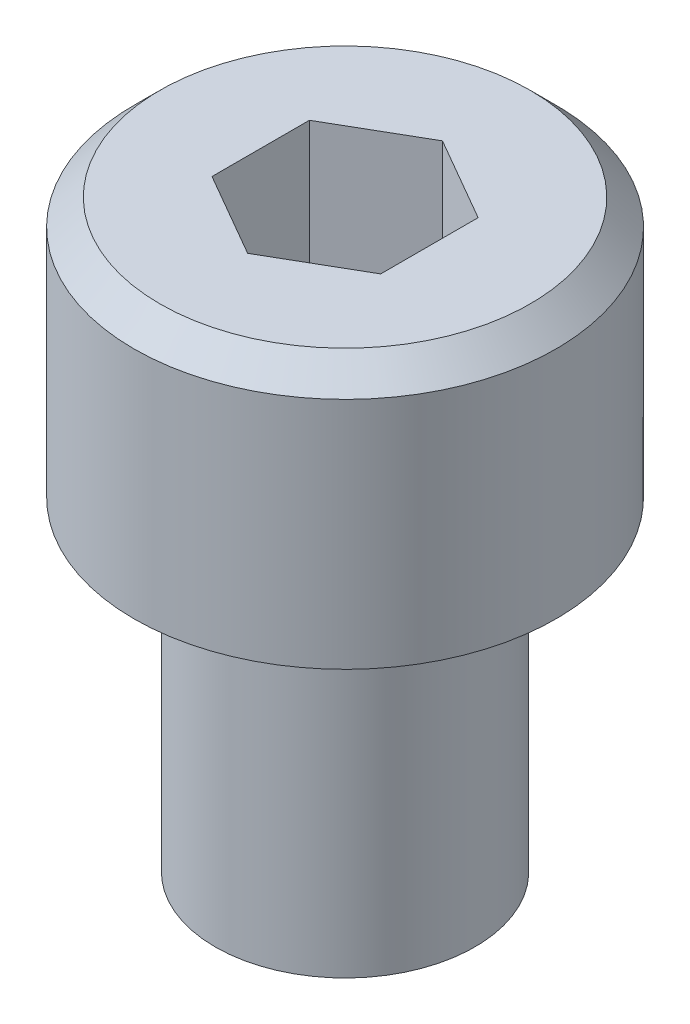
ISO-10303-21;
HEADER;
FILE_DESCRIPTION(('STEP AP214'),'2;1');
FILE_NAME('part.step','',(''),(''),'','','');
FILE_SCHEMA(('AUTOMOTIVE_DESIGN { 1 0 10303 214 1 1 1 1 }'));
ENDSEC;
DATA;
#1=APPLICATION_CONTEXT('core data for automotive mechanical design processes');
#2=APPLICATION_PROTOCOL_DEFINITION('international standard','automotive_design',2000,#1);
#3=PRODUCT_CONTEXT('',#1,'mechanical');
#4=PRODUCT('Part','Part','',(#3));
#5=PRODUCT_RELATED_PRODUCT_CATEGORY('part','',(#4));
#6=PRODUCT_DEFINITION_FORMATION('','',#4);
#7=PRODUCT_DEFINITION_CONTEXT('part definition',#1,'design');
#8=PRODUCT_DEFINITION('design','',#6,#7);
#9=PRODUCT_DEFINITION_SHAPE('','',#8);
#10=(LENGTH_UNIT() NAMED_UNIT(*) SI_UNIT(.MILLI.,.METRE.));
#11=(NAMED_UNIT(*) PLANE_ANGLE_UNIT() SI_UNIT($,.RADIAN.));
#12=(NAMED_UNIT(*) SI_UNIT($,.STERADIAN.) SOLID_ANGLE_UNIT());
#13=UNCERTAINTY_MEASURE_WITH_UNIT(LENGTH_MEASURE(1.E-05),#10,'distance_accuracy_value','');
#14=(GEOMETRIC_REPRESENTATION_CONTEXT(3) GLOBAL_UNCERTAINTY_ASSIGNED_CONTEXT((#13)) GLOBAL_UNIT_ASSIGNED_CONTEXT((#10,
#11,#12)) REPRESENTATION_CONTEXT('',''));
#15=CARTESIAN_POINT('',(0.,0.,0.));
#16=DIRECTION('',(0.,0.,1.));
#17=DIRECTION('',(1.,0.,0.));
#18=AXIS2_PLACEMENT_3D('',#15,#16,#17);
#19=CARTESIAN_POINT('',(0.,0.,0.));
#20=DIRECTION('',(0.,1.,0.));
#21=DIRECTION('',(0.,0.,1.));
#22=AXIS2_PLACEMENT_3D('',#19,#20,#21);
#23=PLANE('',#22);
#24=CARTESIAN_POINT('',(0.,0.,0.));
#25=DIRECTION('',(0.,1.,0.));
#26=DIRECTION('',(0.,0.,1.));
#27=AXIS2_PLACEMENT_3D('',#24,#25,#26);
#28=CIRCLE('',#27,6.5);
#29=CARTESIAN_POINT('',(0.,0.,6.5));
#30=VERTEX_POINT('',#29);
#31=EDGE_CURVE('E192',#30,#30,#28,.T.);
#32=ORIENTED_EDGE('',*,*,#31,.F.);
#33=EDGE_LOOP('',(#32));
#34=FACE_BOUND('',#33,.T.);
#35=CARTESIAN_POINT('',(0.,0.,0.));
#36=DIRECTION('',(0.,1.,0.));
#37=DIRECTION('',(0.,0.,1.));
#38=AXIS2_PLACEMENT_3D('',#35,#36,#37);
#39=CIRCLE('',#38,4.);
#40=CARTESIAN_POINT('',(0.,0.,4.));
#41=VERTEX_POINT('',#40);
#42=EDGE_CURVE('E11',#41,#41,#39,.F.);
#43=ORIENTED_EDGE('',*,*,#42,.F.);
#44=EDGE_LOOP('',(#43));
#45=FACE_BOUND('',#44,.T.);
#46=ADVANCED_FACE('F32',(#34,#45),#23,.F.);
#47=CARTESIAN_POINT('',(0.,8.,0.));
#48=DIRECTION('',(0.,1.,0.));
#49=DIRECTION('',(0.,0.,1.));
#50=AXIS2_PLACEMENT_3D('',#47,#48,#49);
#51=PLANE('',#50);
#52=CARTESIAN_POINT('',(0.,8.,0.));
#53=DIRECTION('',(0.,1.,0.));
#54=DIRECTION('',(0.,0.,1.));
#55=AXIS2_PLACEMENT_3D('',#52,#53,#54);
#56=CIRCLE('',#55,5.7);
#57=CARTESIAN_POINT('',(0.,8.,5.7));
#58=VERTEX_POINT('',#57);
#59=EDGE_CURVE('E105',#58,#58,#56,.T.);
#60=ORIENTED_EDGE('',*,*,#59,.T.);
#61=EDGE_LOOP('',(#60));
#62=FACE_BOUND('',#61,.T.);
#63=DIRECTION('',(-0.866025403784439,0.,0.5));
#64=VECTOR('',#63,1.);
#65=CARTESIAN_POINT('',(0.,8.,-3.));
#66=LINE('',#65,#64);
#67=CARTESIAN_POINT('',(0.,8.,-3.));
#68=VERTEX_POINT('',#67);
#69=CARTESIAN_POINT('',(-2.59807621135332,8.,-1.5));
#70=VERTEX_POINT('',#69);
#71=EDGE_CURVE('E168',#68,#70,#66,.T.);
#72=ORIENTED_EDGE('',*,*,#71,.F.);
#73=DIRECTION('',(-0.866025403784439,0.,-0.5));
#74=VECTOR('',#73,1.);
#75=CARTESIAN_POINT('',(2.59807621135332,8.,-1.5));
#76=LINE('',#75,#74);
#77=CARTESIAN_POINT('',(2.59807621135332,8.,-1.5));
#78=VERTEX_POINT('',#77);
#79=EDGE_CURVE('E166',#78,#68,#76,.T.);
#80=ORIENTED_EDGE('',*,*,#79,.F.);
#81=DIRECTION('',(0.,0.,-1.));
#82=VECTOR('',#81,1.);
#83=CARTESIAN_POINT('',(2.59807621135332,8.,1.5));
#84=LINE('',#83,#82);
#85=CARTESIAN_POINT('',(2.59807621135332,8.,1.5));
#86=VERTEX_POINT('',#85);
#87=EDGE_CURVE('E177',#86,#78,#84,.T.);
#88=ORIENTED_EDGE('',*,*,#87,.F.);
#89=DIRECTION('',(0.866025403784439,0.,-0.5));
#90=VECTOR('',#89,1.);
#91=CARTESIAN_POINT('',(0.,8.,3.));
#92=LINE('',#91,#90);
#93=CARTESIAN_POINT('',(0.,8.,3.));
#94=VERTEX_POINT('',#93);
#95=EDGE_CURVE('E174',#94,#86,#92,.T.);
#96=ORIENTED_EDGE('',*,*,#95,.F.);
#97=DIRECTION('',(0.866025403784439,0.,0.5));
#98=VECTOR('',#97,1.);
#99=CARTESIAN_POINT('',(-2.59807621135332,8.,1.5));
#100=LINE('',#99,#98);
#101=CARTESIAN_POINT('',(-2.59807621135332,8.,1.5));
#102=VERTEX_POINT('',#101);
#103=EDGE_CURVE('E172',#102,#94,#100,.T.);
#104=ORIENTED_EDGE('',*,*,#103,.F.);
#105=DIRECTION('',(0.,0.,1.));
#106=VECTOR('',#105,1.);
#107=CARTESIAN_POINT('',(-2.59807621135332,8.,-1.5));
#108=LINE('',#107,#106);
#109=EDGE_CURVE('E170',#70,#102,#108,.T.);
#110=ORIENTED_EDGE('',*,*,#109,.F.);
#111=EDGE_LOOP('',(#72,#80,#88,#96,#104,#110));
#112=FACE_BOUND('',#111,.T.);
#113=ADVANCED_FACE('F160',(#62,#112),#51,.T.);
#114=CARTESIAN_POINT('',(0.,8.,0.));
#115=DIRECTION('',(0.,-1.,0.));
#116=DIRECTION('',(0.,0.,-1.));
#117=AXIS2_PLACEMENT_3D('',#114,#115,#116);
#118=CYLINDRICAL_SURFACE('',#117,6.5);
#119=CARTESIAN_POINT('',(0.,7.2,0.));
#120=DIRECTION('',(0.,1.,0.));
#121=DIRECTION('',(0.,0.,1.));
#122=AXIS2_PLACEMENT_3D('',#119,#120,#121);
#123=CIRCLE('',#122,6.5);
#124=CARTESIAN_POINT('',(0.,7.2,6.5));
#125=VERTEX_POINT('',#124);
#126=EDGE_CURVE('E103',#125,#125,#123,.F.);
#127=ORIENTED_EDGE('',*,*,#126,.T.);
#128=EDGE_LOOP('',(#127));
#129=FACE_BOUND('',#128,.T.);
#130=ORIENTED_EDGE('',*,*,#31,.T.);
#131=EDGE_LOOP('',(#130));
#132=FACE_BOUND('',#131,.T.);
#133=ADVANCED_FACE('F158',(#129,#132),#118,.T.);
#134=CARTESIAN_POINT('',(2.59807621135332,8.,-1.5));
#135=DIRECTION('',(-0.5,0.,0.866025403784439));
#136=DIRECTION('',(0.866025403784439,0.,0.5));
#137=AXIS2_PLACEMENT_3D('',#134,#135,#136);
#138=PLANE('',#137);
#139=CARTESIAN_POINT('',(2.59827621135332,4.00006667051552,-1.49988452994616));
#140=CARTESIAN_POINT('',(2.48410312110888,3.96199359130715,-1.565802394333));
#141=CARTESIAN_POINT('',(2.36894449782545,3.92736728207955,-1.63228925648519));
#142=CARTESIAN_POINT('',(2.13663308160766,3.86692617986275,-1.76641431517436));
#143=CARTESIAN_POINT('',(2.01947616025459,3.84113276963105,-1.83405489525498));
#144=CARTESIAN_POINT('',(1.78661428590626,3.8009808408714,-1.96849776109399));
#145=CARTESIAN_POINT('',(1.67094516540256,3.78635510237306,-2.03527935895373));
#146=CARTESIAN_POINT('',(1.43906255020641,3.76889374833294,-2.16915684925762));
#147=CARTESIAN_POINT('',(1.32284989857051,3.76604367461966,-2.23625225496285));
#148=CARTESIAN_POINT('',(1.10569266494398,3.77196692561168,-2.3616280422536));
#149=CARTESIAN_POINT('',(1.0047156060181,3.77928588950686,-2.41992717440643));
#150=CARTESIAN_POINT('',(0.803419365604432,3.80248453946945,-2.53614561299612));
#151=CARTESIAN_POINT('',(0.703100880569998,3.81837215330175,-2.59406451733545));
#152=CARTESIAN_POINT('',(0.501389470507969,3.85809067891933,-2.71052265423338));
#153=CARTESIAN_POINT('',(0.400022080518307,3.88208998754321,-2.76904714413096));
#154=CARTESIAN_POINT('',(0.198799334106378,3.93655925692104,-2.88522315093896));
#155=CARTESIAN_POINT('',(0.0989413989158062,3.96701641592601,-2.94287615670196));
#156=CARTESIAN_POINT('',(-0.000200000000000171,4.00006667051552,-3.00011547005384));
#157=B_SPLINE_CURVE_WITH_KNOTS('',3,(#139,#140,#141,#142,#143,#144,#145,#146,#147,#148,#149,
#150,#151,#152,#153,#154,#155,#156),.UNSPECIFIED.,.F.,.F.,(4,2,2,2,2,2,2,2,4),(0.,
0.411831692004533,0.824653416366171,1.22725753984408,1.62936719846512,1.97951716110399,
2.3299916416744,2.68824112006884,3.04578695197158),.UNSPECIFIED.);
#158=CARTESIAN_POINT('',(2.59807621135332,4.,-1.5));
#159=VERTEX_POINT('',#158);
#160=CARTESIAN_POINT('',(0.,4.,-3.));
#161=VERTEX_POINT('',#160);
#162=EDGE_CURVE('E98',#159,#161,#157,.T.);
#163=ORIENTED_EDGE('',*,*,#162,.F.);
#164=DIRECTION('',(0.,-1.,0.));
#165=VECTOR('',#164,1.);
#166=CARTESIAN_POINT('',(2.59807621135332,8.,-1.5));
#167=LINE('',#166,#165);
#168=EDGE_CURVE('E179',#78,#159,#167,.T.);
#169=ORIENTED_EDGE('',*,*,#168,.F.);
#170=ORIENTED_EDGE('',*,*,#79,.T.);
#171=DIRECTION('',(0.,-1.,0.));
#172=VECTOR('',#171,1.);
#173=CARTESIAN_POINT('',(0.,8.,-3.));
#174=LINE('',#173,#172);
#175=EDGE_CURVE('E190',#68,#161,#174,.T.);
#176=ORIENTED_EDGE('',*,*,#175,.T.);
#177=EDGE_LOOP('',(#163,#169,#170,#176));
#178=FACE_BOUND('',#177,.T.);
#179=ADVANCED_FACE('F154',(#178),#138,.T.);
#180=CARTESIAN_POINT('',(0.,8.,-3.));
#181=DIRECTION('',(0.5,0.,0.866025403784439));
#182=DIRECTION('',(0.866025403784439,0.,-0.5));
#183=AXIS2_PLACEMENT_3D('',#180,#181,#182);
#184=PLANE('',#183);
#185=CARTESIAN_POINT('',(0.000199999999999878,4.00006667051552,-3.00011547005384));
#186=CARTESIAN_POINT('',(-0.113973090244438,3.96199359130715,-2.934197605667));
#187=CARTESIAN_POINT('',(-0.229131713527861,3.92736728207955,-2.86771074351481));
#188=CARTESIAN_POINT('',(-0.461443129745653,3.86692617986275,-2.73358568482564));
#189=CARTESIAN_POINT('',(-0.578600051098723,3.84113276963105,-2.66594510474502));
#190=CARTESIAN_POINT('',(-0.811461925447057,3.8009808408714,-2.53150223890601));
#191=CARTESIAN_POINT('',(-0.927131045950753,3.78635510237306,-2.46472064104627));
#192=CARTESIAN_POINT('',(-1.1590136611469,3.76889374833294,-2.33084315074238));
#193=CARTESIAN_POINT('',(-1.27522631278281,3.76604367461966,-2.26374774503715));
#194=CARTESIAN_POINT('',(-1.49238354640933,3.77196692561168,-2.1383719577464));
#195=CARTESIAN_POINT('',(-1.59336060533522,3.77928588950686,-2.08007282559357));
#196=CARTESIAN_POINT('',(-1.79465684574888,3.80248453946945,-1.96385438700388));
#197=CARTESIAN_POINT('',(-1.89497533078332,3.81837215330175,-1.90593548266455));
#198=CARTESIAN_POINT('',(-2.09668674084535,3.85809067891933,-1.78947734576662));
#199=CARTESIAN_POINT('',(-2.19805413083501,3.88208998754321,-1.73095285586904));
#200=CARTESIAN_POINT('',(-2.39927687724694,3.93655925692104,-1.61477684906104));
#201=CARTESIAN_POINT('',(-2.49913481243751,3.96701641592601,-1.55712384329804));
#202=CARTESIAN_POINT('',(-2.59827621135332,4.00006667051552,-1.49988452994616));
#203=B_SPLINE_CURVE_WITH_KNOTS('',3,(#185,#186,#187,#188,#189,#190,#191,#192,#193,#194,#195,
#196,#197,#198,#199,#200,#201,#202),.UNSPECIFIED.,.F.,.F.,(4,2,2,2,2,2,2,2,4),(0.,
0.411831692004532,0.824653416366171,1.22725753984408,1.62936719846512,1.97951716110399,
2.3299916416744,2.68824112006885,3.04578695197158),.UNSPECIFIED.);
#204=CARTESIAN_POINT('',(-2.59807621135332,4.,-1.5));
#205=VERTEX_POINT('',#204);
#206=EDGE_CURVE('E47',#161,#205,#203,.T.);
#207=ORIENTED_EDGE('',*,*,#206,.F.);
#208=ORIENTED_EDGE('',*,*,#175,.F.);
#209=ORIENTED_EDGE('',*,*,#71,.T.);
#210=DIRECTION('',(0.,-1.,0.));
#211=VECTOR('',#210,1.);
#212=CARTESIAN_POINT('',(-2.59807621135332,8.,-1.5));
#213=LINE('',#212,#211);
#214=EDGE_CURVE('E188',#70,#205,#213,.T.);
#215=ORIENTED_EDGE('',*,*,#214,.T.);
#216=EDGE_LOOP('',(#207,#208,#209,#215));
#217=FACE_BOUND('',#216,.T.);
#218=ADVANCED_FACE('F150',(#217),#184,.T.);
#219=CARTESIAN_POINT('',(-2.59807621135332,8.,-1.5));
#220=DIRECTION('',(1.,0.,0.));
#221=DIRECTION('',(0.,0.,-1.));
#222=AXIS2_PLACEMENT_3D('',#219,#220,#221);
#223=PLANE('',#222);
#224=CARTESIAN_POINT('',(-2.59807621135332,4.9660564188862,-3.8845009739151));
#225=CARTESIAN_POINT('',(-2.59807621135332,4.91223004150081,-3.77230709557267));
#226=CARTESIAN_POINT('',(-2.59807621135332,4.85896274789201,-3.65983989760996));
#227=CARTESIAN_POINT('',(-2.59807621135332,4.75386348706402,-3.43421319028033));
#228=CARTESIAN_POINT('',(-2.59807621135332,4.70203177815466,-3.32105356073687));
#229=CARTESIAN_POINT('',(-2.59807621135332,4.59983128671114,-3.09324749373573));
#230=CARTESIAN_POINT('',(-2.59807621135332,4.54947328558064,-2.97859620115922));
#231=CARTESIAN_POINT('',(-2.59807621135332,4.45101546208214,-2.74833153742352));
#232=CARTESIAN_POINT('',(-2.59807621135332,4.40291552229869,-2.63271821665704));
#233=CARTESIAN_POINT('',(-2.59807621135332,4.30835029641162,-2.39730013081103));
#234=CARTESIAN_POINT('',(-2.59807621135332,4.26196063034016,-2.27746481041647));
#235=CARTESIAN_POINT('',(-2.59807621135332,4.17303817348946,-2.03634466990009));
#236=CARTESIAN_POINT('',(-2.59807621135332,4.13050583005042,-1.91505968349933));
#237=CARTESIAN_POINT('',(-2.59807621135332,4.05051430401837,-1.67112739501849));
#238=CARTESIAN_POINT('',(-2.59807621135332,4.01304338905763,-1.54848398216075));
#239=CARTESIAN_POINT('',(-2.59807621135332,3.94445616840961,-1.30143948321004));
#240=CARTESIAN_POINT('',(-2.59807621135332,3.91333828450946,-1.17703884187606));
#241=CARTESIAN_POINT('',(-2.59807621135332,3.85911594296494,-0.926739022989941));
#242=CARTESIAN_POINT('',(-2.59807621135332,3.8359950267883,-0.800843481493282));
#243=CARTESIAN_POINT('',(-2.59807621135332,3.79928061803726,-0.54764389644838));
#244=CARTESIAN_POINT('',(-2.59807621135332,3.78568648162573,-0.420339948673571));
#245=CARTESIAN_POINT('',(-2.59807621135332,3.76928690196155,-0.16655372639389));
#246=CARTESIAN_POINT('',(-2.59807621135332,3.7663541448504,-0.0400798824395624));
#247=CARTESIAN_POINT('',(-2.59807621135332,3.77119863872966,0.212670113480849));
#248=CARTESIAN_POINT('',(-2.59807621135332,3.77897655288438,0.338946252721145));
#249=CARTESIAN_POINT('',(-2.59807621135332,3.80119377857193,0.557599644529635));
#250=CARTESIAN_POINT('',(-2.59807621135332,3.81336335681522,0.65021865776327));
#251=CARTESIAN_POINT('',(-2.59807621135332,3.8426274656891,0.834682165985316));
#252=CARTESIAN_POINT('',(-2.59807621135332,3.85972284849232,0.926526524124829));
#253=CARTESIAN_POINT('',(-2.59807621135332,3.91749355570275,1.20085028166556));
#254=CARTESIAN_POINT('',(-2.59807621135332,3.96463713062436,1.38197748202941));
#255=CARTESIAN_POINT('',(-2.59807621135332,4.04517962115256,1.65281702888396));
#256=CARTESIAN_POINT('',(-2.59807621135332,4.07404068530788,1.74395707421708));
#257=CARTESIAN_POINT('',(-2.59807621135332,4.13443178374335,1.92529369562089));
#258=CARTESIAN_POINT('',(-2.59807621135332,4.1659601523765,2.01549082154421));
#259=CARTESIAN_POINT('',(-2.59807621135332,4.2312290192953,2.19505541845558));
#260=CARTESIAN_POINT('',(-2.59807621135332,4.26496911556024,2.28442303686853));
#261=CARTESIAN_POINT('',(-2.59807621135332,4.3342959724806,2.46245455716896));
#262=CARTESIAN_POINT('',(-2.59807621135332,4.36988304513722,2.55111833722455));
#263=CARTESIAN_POINT('',(-2.59807621135332,4.46300099647175,2.77743540120493));
#264=CARTESIAN_POINT('',(-2.59807621135332,4.52163108928972,2.91463583059346));
#265=CARTESIAN_POINT('',(-2.59807621135332,4.64171189090278,3.18780060470032));
#266=CARTESIAN_POINT('',(-2.59807621135332,4.70316281099973,3.32376485590235));
#267=CARTESIAN_POINT('',(-2.59807621135332,4.82824468979488,3.59471286558531));
#268=CARTESIAN_POINT('',(-2.59807621135332,4.8918760266657,3.72969644900772));
#269=CARTESIAN_POINT('',(-2.59807621135332,5.0208380432957,3.99885068054764));
#270=CARTESIAN_POINT('',(-2.59807621135332,5.08616876084577,4.13302131050472));
#271=CARTESIAN_POINT('',(-2.59807621135332,5.28431856090936,4.53486694010202));
#272=CARTESIAN_POINT('',(-2.59807621135332,5.41914357087246,4.80155187793865));
#273=CARTESIAN_POINT('',(-2.59807621135332,5.6922416939684,5.33309578037174));
#274=CARTESIAN_POINT('',(-2.59807621135332,5.83051436880545,5.59795497166264));
#275=CARTESIAN_POINT('',(-2.59807621135332,6.09628868282013,6.10146905697631));
#276=CARTESIAN_POINT('',(-2.59807621135331,6.22357512913202,6.34023772088153));
#277=CARTESIAN_POINT('',(-2.59807621135331,6.4795971904626,6.8170070733135));
#278=CARTESIAN_POINT('',(-2.59807621135331,6.60833285911072,7.05500773299764));
#279=CARTESIAN_POINT('',(-2.59807621135331,6.86656223695508,7.52981268212846));
#280=CARTESIAN_POINT('',(-2.59807621135331,6.99605318520509,7.76661847482293));
#281=CARTESIAN_POINT('',(-2.59807621135331,7.25587788101754,8.23975129511175));
#282=CARTESIAN_POINT('',(-2.59807621135331,7.38621158411984,8.47607834711237));
#283=CARTESIAN_POINT('',(-2.59807621135331,7.51685418770397,8.71223340758277));
#284=B_SPLINE_CURVE_WITH_KNOTS('',3,(#224,#225,#226,#227,#228,#229,#230,#231,#232,#233,#234,
#235,#236,#237,#238,#239,#240,#241,#242,#243,#244,#245,#246,#247,#248,#249,#250,#251,#252,#253,
#254,#255,#256,#257,#258,#259,#260,#261,#262,#263,#264,#265,#266,#267,#268,#269,#270,#271,#272,
#273,#274,#275,#276,#277,#278,#279,#280,#281,#282,#283),.UNSPECIFIED.,.F.,.F.,(4,2,2,2,2,2,2,2,
2,2,2,2,2,2,2,2,2,2,2,2,2,2,2,2,2,2,2,2,2,4),(0.,0.373318455451328,0.74670365268357,
1.12235381777871,1.49798442800332,1.88343615104459,2.26893251856125,2.65351938394541,
3.03801059412742,3.4217057086918,3.80537488993968,4.18444711483999,4.56354281151544,
4.84364965516723,5.12380498690819,5.68454517363784,5.97132664537964,6.2579303347349,
6.54448207247092,6.83108237462811,7.27864469050258,7.72624058715208,8.173914511957,
8.62159840067824,9.51803870345279,10.4143656185678,11.226092072342,12.0378486639854,
12.8475405363305,13.6571900357622),.UNSPECIFIED.);
#285=CARTESIAN_POINT('',(-2.59807621135332,4.,1.5));
#286=VERTEX_POINT('',#285);
#287=EDGE_CURVE('E55',#205,#286,#284,.T.);
#288=ORIENTED_EDGE('',*,*,#287,.F.);
#289=ORIENTED_EDGE('',*,*,#214,.F.);
#290=ORIENTED_EDGE('',*,*,#109,.T.);
#291=DIRECTION('',(0.,-1.,0.));
#292=VECTOR('',#291,1.);
#293=CARTESIAN_POINT('',(-2.59807621135332,8.,1.5));
#294=LINE('',#293,#292);
#295=EDGE_CURVE('E186',#102,#286,#294,.T.);
#296=ORIENTED_EDGE('',*,*,#295,.T.);
#297=EDGE_LOOP('',(#288,#289,#290,#296));
#298=FACE_BOUND('',#297,.T.);
#299=ADVANCED_FACE('F147',(#298),#223,.T.);
#300=CARTESIAN_POINT('',(-2.59807621135332,8.,1.5));
#301=DIRECTION('',(0.5,0.,-0.866025403784439));
#302=DIRECTION('',(-0.866025403784439,0.,-0.5));
#303=AXIS2_PLACEMENT_3D('',#300,#301,#302);
#304=PLANE('',#303);
#305=CARTESIAN_POINT('',(-2.59827621135332,4.00006667051552,1.49988452994616));
#306=CARTESIAN_POINT('',(-2.48410312110888,3.96199359130715,1.565802394333));
#307=CARTESIAN_POINT('',(-2.36894449782546,3.92736728207955,1.63228925648519));
#308=CARTESIAN_POINT('',(-2.13663308160766,3.86692617986275,1.76641431517436));
#309=CARTESIAN_POINT('',(-2.01947616025459,3.84113276963105,1.83405489525498));
#310=CARTESIAN_POINT('',(-1.78661428590626,3.8009808408714,1.96849776109399));
#311=CARTESIAN_POINT('',(-1.67094516540256,3.78635510237306,2.03527935895373));
#312=CARTESIAN_POINT('',(-1.43906255020642,3.76889374833294,2.16915684925762));
#313=CARTESIAN_POINT('',(-1.32284989857051,3.76604367461966,2.23625225496285));
#314=CARTESIAN_POINT('',(-1.10569266494398,3.77196692561168,2.3616280422536));
#315=CARTESIAN_POINT('',(-1.0047156060181,3.77928588950686,2.41992717440643));
#316=CARTESIAN_POINT('',(-0.803419365604433,3.80248453946945,2.53614561299612));
#317=CARTESIAN_POINT('',(-0.703100880569998,3.81837215330175,2.59406451733545));
#318=CARTESIAN_POINT('',(-0.50138947050797,3.85809067891933,2.71052265423338));
#319=CARTESIAN_POINT('',(-0.400022080518307,3.88208998754321,2.76904714413096));
#320=CARTESIAN_POINT('',(-0.198799334106378,3.93655925692104,2.88522315093896));
#321=CARTESIAN_POINT('',(-0.0989413989158059,3.96701641592601,2.94287615670196));
#322=CARTESIAN_POINT('',(0.000199999999999829,4.00006667051552,3.00011547005384));
#323=B_SPLINE_CURVE_WITH_KNOTS('',3,(#305,#306,#307,#308,#309,#310,#311,#312,#313,#314,#315,
#316,#317,#318,#319,#320,#321,#322),.UNSPECIFIED.,.F.,.F.,(4,2,2,2,2,2,2,2,4),(0.,
0.411831692004532,0.82465341636617,1.22725753984408,1.62936719846511,1.97951716110399,
2.3299916416744,2.68824112006884,3.04578695197158),.UNSPECIFIED.);
#324=CARTESIAN_POINT('',(0.,4.,3.));
#325=VERTEX_POINT('',#324);
#326=EDGE_CURVE('E132',#286,#325,#323,.T.);
#327=ORIENTED_EDGE('',*,*,#326,.F.);
#328=ORIENTED_EDGE('',*,*,#295,.F.);
#329=ORIENTED_EDGE('',*,*,#103,.T.);
#330=DIRECTION('',(0.,-1.,0.));
#331=VECTOR('',#330,1.);
#332=CARTESIAN_POINT('',(0.,8.,3.));
#333=LINE('',#332,#331);
#334=EDGE_CURVE('E183',#94,#325,#333,.T.);
#335=ORIENTED_EDGE('',*,*,#334,.T.);
#336=EDGE_LOOP('',(#327,#328,#329,#335));
#337=FACE_BOUND('',#336,.T.);
#338=ADVANCED_FACE('F122',(#337),#304,.T.);
#339=CARTESIAN_POINT('',(0.,8.,3.));
#340=DIRECTION('',(-0.5,0.,-0.866025403784439));
#341=DIRECTION('',(-0.866025403784439,0.,0.5));
#342=AXIS2_PLACEMENT_3D('',#339,#340,#341);
#343=PLANE('',#342);
#344=CARTESIAN_POINT('',(-0.000200000000000231,4.00006667051552,3.00011547005384));
#345=CARTESIAN_POINT('',(0.113973090244437,3.96199359130715,2.934197605667));
#346=CARTESIAN_POINT('',(0.229131713527861,3.92736728207955,2.86771074351481));
#347=CARTESIAN_POINT('',(0.461443129745653,3.86692617986275,2.73358568482564));
#348=CARTESIAN_POINT('',(0.578600051098723,3.84113276963105,2.66594510474502));
#349=CARTESIAN_POINT('',(0.811461925447056,3.8009808408714,2.53150223890601));
#350=CARTESIAN_POINT('',(0.927131045950752,3.78635510237306,2.46472064104627));
#351=CARTESIAN_POINT('',(1.1590136611469,3.76889374833294,2.33084315074238));
#352=CARTESIAN_POINT('',(1.27522631278281,3.76604367461966,2.26374774503715));
#353=CARTESIAN_POINT('',(1.49238354640933,3.77196692561168,2.1383719577464));
#354=CARTESIAN_POINT('',(1.59336060533522,3.77928588950686,2.08007282559357));
#355=CARTESIAN_POINT('',(1.79465684574888,3.80248453946945,1.96385438700388));
#356=CARTESIAN_POINT('',(1.89497533078332,3.81837215330176,1.90593548266455));
#357=CARTESIAN_POINT('',(2.09668674084535,3.85809067891933,1.78947734576662));
#358=CARTESIAN_POINT('',(2.19805413083501,3.88208998754321,1.73095285586904));
#359=CARTESIAN_POINT('',(2.39927687724694,3.93655925692104,1.61477684906104));
#360=CARTESIAN_POINT('',(2.49913481243751,3.96701641592601,1.55712384329804));
#361=CARTESIAN_POINT('',(2.59827621135332,4.00006667051552,1.49988452994616));
#362=B_SPLINE_CURVE_WITH_KNOTS('',3,(#344,#345,#346,#347,#348,#349,#350,#351,#352,#353,#354,
#355,#356,#357,#358,#359,#360,#361),.UNSPECIFIED.,.F.,.F.,(4,2,2,2,2,2,2,2,4),(0.,
0.411831692004533,0.824653416366171,1.22725753984408,1.62936719846512,1.97951716110399,
2.3299916416744,2.68824112006885,3.04578695197158),.UNSPECIFIED.);
#363=CARTESIAN_POINT('',(2.59807621135332,4.,1.5));
#364=VERTEX_POINT('',#363);
#365=EDGE_CURVE('E100',#325,#364,#362,.T.);
#366=ORIENTED_EDGE('',*,*,#365,.F.);
#367=ORIENTED_EDGE('',*,*,#334,.F.);
#368=ORIENTED_EDGE('',*,*,#95,.T.);
#369=DIRECTION('',(0.,-1.,0.));
#370=VECTOR('',#369,1.);
#371=CARTESIAN_POINT('',(2.59807621135332,8.,1.5));
#372=LINE('',#371,#370);
#373=EDGE_CURVE('E181',#86,#364,#372,.T.);
#374=ORIENTED_EDGE('',*,*,#373,.T.);
#375=EDGE_LOOP('',(#366,#367,#368,#374));
#376=FACE_BOUND('',#375,.T.);
#377=ADVANCED_FACE('F118',(#376),#343,.T.);
#378=CARTESIAN_POINT('',(2.59807621135332,8.,1.5));
#379=DIRECTION('',(-1.,0.,0.));
#380=DIRECTION('',(0.,0.,1.));
#381=AXIS2_PLACEMENT_3D('',#378,#379,#380);
#382=PLANE('',#381);
#383=CARTESIAN_POINT('',(2.59807621135331,4.9660564182157,-3.88450097251795));
#384=CARTESIAN_POINT('',(2.59807621135332,4.9122300408592,-3.77230709422327));
#385=CARTESIAN_POINT('',(2.59807621135332,4.85896274727927,-3.65983989630834));
#386=CARTESIAN_POINT('',(2.59807621135332,4.75386348650885,-3.43421318907446));
#387=CARTESIAN_POINT('',(2.59807621135332,4.7020317776282,-3.32105355957895));
#388=CARTESIAN_POINT('',(2.59807621135332,4.59983128624212,-3.09324749267464));
#389=CARTESIAN_POINT('',(2.59807621135332,4.54947328514036,-2.97859620014701));
#390=CARTESIAN_POINT('',(2.59807621135332,4.45101546169877,-2.74833153650943));
#391=CARTESIAN_POINT('',(2.59807621135332,4.4029155219435,-2.63271821579221));
#392=CARTESIAN_POINT('',(2.59807621135332,4.30835029611296,-2.39730013004759));
#393=CARTESIAN_POINT('',(2.59807621135332,4.26196063006981,-2.27746480970518));
#394=CARTESIAN_POINT('',(2.59807621135332,4.17303817327399,-2.03634466929403));
#395=CARTESIAN_POINT('',(2.59807621135332,4.13050582986153,-1.91505968294635));
#396=CARTESIAN_POINT('',(2.59807621135332,4.0505143038797,-1.67112739457265));
#397=CARTESIAN_POINT('',(2.59807621135332,4.01304338894263,-1.54848398176898));
#398=CARTESIAN_POINT('',(2.59807621135332,3.94445616833753,-1.30143948292794));
#399=CARTESIAN_POINT('',(2.59807621135332,3.91333828445662,-1.17703884164956));
#400=CARTESIAN_POINT('',(2.59807621135332,3.85911594294746,-0.926739022891916));
#401=CARTESIAN_POINT('',(2.59807621135332,3.83599502678594,-0.800843481468342));
#402=CARTESIAN_POINT('',(2.59807621135332,3.79928061805381,-0.547643896571147));
#403=CARTESIAN_POINT('',(2.59807621135332,3.78568648164607,-0.420339948870954));
#404=CARTESIAN_POINT('',(2.59807621135332,3.76928690197638,-0.166553726739118));
#405=CARTESIAN_POINT('',(2.59807621135332,3.76635414485614,-0.0400798828580128));
#406=CARTESIAN_POINT('',(2.59807621135332,3.7711986387051,0.212670112917326));
#407=CARTESIAN_POINT('',(2.59807621135332,3.7789765528386,0.338946252085772));
#408=CARTESIAN_POINT('',(2.59807621135332,3.80119377848392,0.557599643800596));
#409=CARTESIAN_POINT('',(2.59807621135332,3.81336335671008,0.650218657011645));
#410=CARTESIAN_POINT('',(2.59807621135332,3.84262746554874,0.834682165189421));
#411=CARTESIAN_POINT('',(2.59807621135332,3.85972284833387,0.926526523307247));
#412=CARTESIAN_POINT('',(2.59807621135332,3.91749355548956,1.2008502807839));
#413=CARTESIAN_POINT('',(2.59807621135332,3.96463713037409,1.38197748110643));
#414=CARTESIAN_POINT('',(2.59807621135332,4.04517962084732,1.65281702789908));
#415=CARTESIAN_POINT('',(2.59807621135332,4.07404068498416,1.74395707321118));
#416=CARTESIAN_POINT('',(2.59807621135332,4.13443178338313,1.92529369457312));
#417=CARTESIAN_POINT('',(2.59807621135332,4.16596015199827,2.01549082047561));
#418=CARTESIAN_POINT('',(2.59807621135332,4.23122901888159,2.19505541734542));
#419=CARTESIAN_POINT('',(2.59807621135332,4.26496911512904,2.28442303573766));
#420=CARTESIAN_POINT('',(2.59807621135332,4.33429597201492,2.46245455599663));
#421=CARTESIAN_POINT('',(2.59807621135332,4.36988304465455,2.55111833603149));
#422=CARTESIAN_POINT('',(2.59807621135332,4.46300099596234,2.7774353999981));
#423=CARTESIAN_POINT('',(2.59807621135332,4.52163108877196,2.91463582939315));
#424=CARTESIAN_POINT('',(2.59807621135332,4.64171189037063,3.18780060351221));
#425=CARTESIAN_POINT('',(2.59807621135332,4.70316281046155,3.32376485471994));
#426=CARTESIAN_POINT('',(2.59807621135332,4.82824468924634,3.59471286441371));
#427=CARTESIAN_POINT('',(2.59807621135332,4.89187602611283,3.72969644784122));
#428=CARTESIAN_POINT('',(2.59807621135332,5.0208380427354,3.99885067939083));
#429=CARTESIAN_POINT('',(2.59807621135332,5.08616876028238,4.1330213093525));
#430=CARTESIAN_POINT('',(2.59807621135332,5.28431856033824,4.53486693896338));
#431=CARTESIAN_POINT('',(2.59807621135332,5.41914357029807,4.80155187680841));
#432=CARTESIAN_POINT('',(2.59807621135332,5.69224169338951,5.33309577925722));
#433=CARTESIAN_POINT('',(2.59807621135332,5.83051436822533,5.59795497055545));
#434=CARTESIAN_POINT('',(2.59807621135332,6.09628868223535,6.10146905587579));
#435=CARTESIAN_POINT('',(2.59807621135332,6.22357512854364,6.34023771978043));
#436=CARTESIAN_POINT('',(2.59807621135332,6.47959718986765,6.81700707221095));
#437=CARTESIAN_POINT('',(2.59807621135332,6.6083328585128,7.05500773189421));
#438=CARTESIAN_POINT('',(2.59807621135332,6.86656223635124,7.52981268102223));
#439=CARTESIAN_POINT('',(2.59807621135332,6.99605318459828,7.76661847371478));
#440=CARTESIAN_POINT('',(2.59807621135332,7.25587788040508,8.23975129399957));
#441=CARTESIAN_POINT('',(2.59807621135332,7.38621158350472,8.47607834599809));
#442=CARTESIAN_POINT('',(2.59807621135332,7.51685418708627,8.71223340646633));
#443=B_SPLINE_CURVE_WITH_KNOTS('',3,(#383,#384,#385,#386,#387,#388,#389,#390,#391,#392,#393,
#394,#395,#396,#397,#398,#399,#400,#401,#402,#403,#404,#405,#406,#407,#408,#409,#410,#411,#412,
#413,#414,#415,#416,#417,#418,#419,#420,#421,#422,#423,#424,#425,#426,#427,#428,#429,#430,#431,
#432,#433,#434,#435,#436,#437,#438,#439,#440,#441,#442),.UNSPECIFIED.,.F.,.F.,(4,2,2,2,2,2,2,2,
2,2,2,2,2,2,2,2,2,2,2,2,2,2,2,2,2,2,2,2,2,4),(0.,0.373318455284696,0.746703652350276,
1.1223538172765,1.49798442733221,1.88343615019694,2.268932517537,2.65351938274541,
3.03801059275179,3.42170570709286,3.80537488811771,4.18444711279986,4.56354280925695,
4.84364965283489,5.12380498450197,5.68454517108351,5.97132664274838,6.25793033202681,
6.54448206968613,6.83108237176658,7.27864468764909,7.72624058430668,8.17391450911989,
8.62159839784943,9.51803870064197,10.4143656157747,11.2260920695423,12.0378486611792,
12.847540533515,13.6571900329373),.UNSPECIFIED.);
#444=EDGE_CURVE('E40',#364,#159,#443,.F.);
#445=ORIENTED_EDGE('',*,*,#444,.F.);
#446=ORIENTED_EDGE('',*,*,#373,.F.);
#447=ORIENTED_EDGE('',*,*,#87,.T.);
#448=ORIENTED_EDGE('',*,*,#168,.T.);
#449=EDGE_LOOP('',(#445,#446,#447,#448));
#450=FACE_BOUND('',#449,.T.);
#451=ADVANCED_FACE('F114',(#450),#382,.T.);
#452=CARTESIAN_POINT('',(0.,8.,0.));
#453=DIRECTION('',(0.,-1.,0.));
#454=DIRECTION('',(0.,0.,-1.));
#455=AXIS2_PLACEMENT_3D('',#452,#453,#454);
#456=CONICAL_SURFACE('',#455,5.7,0.785398163397448);
#457=ORIENTED_EDGE('',*,*,#126,.F.);
#458=EDGE_LOOP('',(#457));
#459=FACE_BOUND('',#458,.T.);
#460=ORIENTED_EDGE('',*,*,#59,.F.);
#461=EDGE_LOOP('',(#460));
#462=FACE_BOUND('',#461,.T.);
#463=ADVANCED_FACE('F34',(#459,#462),#456,.T.);
#464=CARTESIAN_POINT('',(0.,4.,0.));
#465=DIRECTION('',(0.,1.,0.));
#466=DIRECTION('',(-1.,0.,0.));
#467=AXIS2_PLACEMENT_3D('',#464,#465,#466);
#468=CONICAL_SURFACE('',#467,3.,1.0471975511966);
#469=CARTESIAN_POINT('',(0.,2.26794919243113,0.));
#470=VERTEX_POINT('',#469);
#471=VERTEX_LOOP('',#470);
#472=FACE_BOUND('',#471,.T.);
#473=ORIENTED_EDGE('',*,*,#444,.T.);
#474=ORIENTED_EDGE('',*,*,#162,.T.);
#475=ORIENTED_EDGE('',*,*,#206,.T.);
#476=ORIENTED_EDGE('',*,*,#287,.T.);
#477=ORIENTED_EDGE('',*,*,#326,.T.);
#478=ORIENTED_EDGE('',*,*,#365,.T.);
#479=EDGE_LOOP('',(#473,#474,#475,#476,#477,#478));
#480=FACE_BOUND('',#479,.T.);
#481=ADVANCED_FACE('F89',(#472,#480),#468,.F.);
#482=CARTESIAN_POINT('',(0.,-10.,0.));
#483=DIRECTION('',(0.,1.,0.));
#484=DIRECTION('',(0.,0.,1.));
#485=AXIS2_PLACEMENT_3D('',#482,#483,#484);
#486=CYLINDRICAL_SURFACE('',#485,4.);
#487=CARTESIAN_POINT('',(0.,-10.,0.));
#488=DIRECTION('',(0.,-1.,0.));
#489=DIRECTION('',(0.,0.,-1.));
#490=AXIS2_PLACEMENT_3D('',#487,#488,#489);
#491=CIRCLE('',#490,4.);
#492=CARTESIAN_POINT('',(0.,-10.,-4.));
#493=VERTEX_POINT('',#492);
#494=EDGE_CURVE('E133',#493,#493,#491,.T.);
#495=ORIENTED_EDGE('',*,*,#494,.F.);
#496=EDGE_LOOP('',(#495));
#497=FACE_BOUND('',#496,.T.);
#498=ORIENTED_EDGE('',*,*,#42,.T.);
#499=EDGE_LOOP('',(#498));
#500=FACE_BOUND('',#499,.T.);
#501=ADVANCED_FACE('F92',(#497,#500),#486,.T.);
#502=CARTESIAN_POINT('',(0.,-10.,0.));
#503=DIRECTION('',(0.,-1.,0.));
#504=DIRECTION('',(0.,0.,-1.));
#505=AXIS2_PLACEMENT_3D('',#502,#503,#504);
#506=PLANE('',#505);
#507=ORIENTED_EDGE('',*,*,#494,.T.);
#508=EDGE_LOOP('',(#507));
#509=FACE_BOUND('',#508,.T.);
#510=ADVANCED_FACE('F265',(#509),#506,.T.);
#511=CLOSED_SHELL('',(#46,#113,#133,#179,#218,#299,#338,#377,#451,#463,#481,#501,#510));
#512=MANIFOLD_SOLID_BREP('B2',#511);
#513=ADVANCED_BREP_SHAPE_REPRESENTATION('',(#18,#512),#14);
#514=SHAPE_DEFINITION_REPRESENTATION(#9,#513);
ENDSEC;
END-ISO-10303-21;
